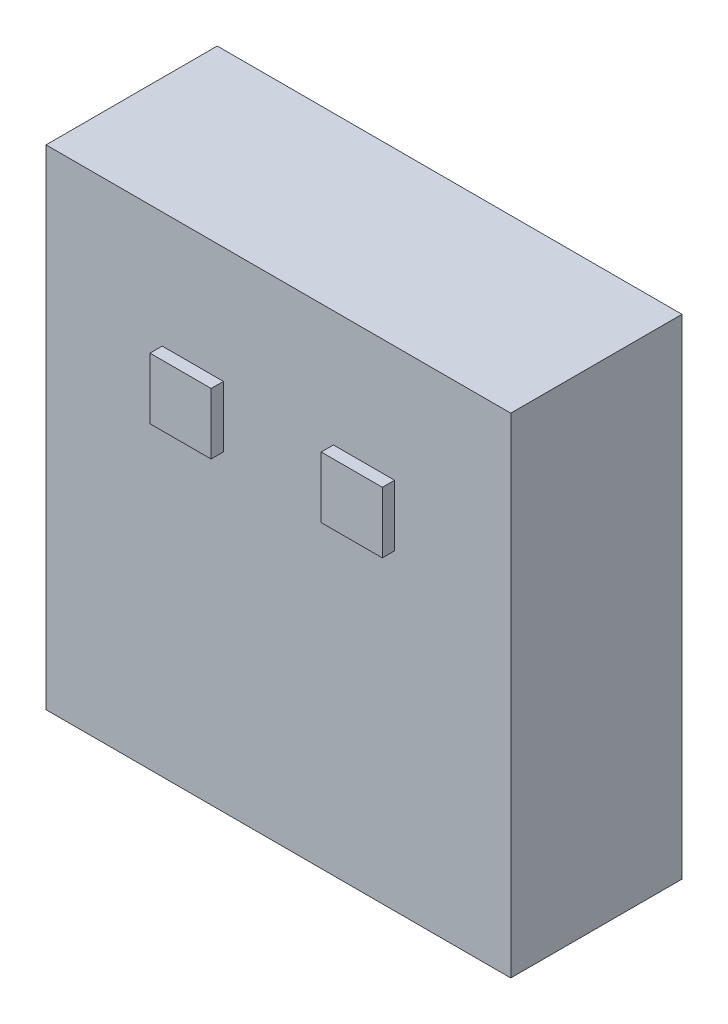
ISO-10303-21;
HEADER;
FILE_DESCRIPTION(('STEP AP214'),'2;1');
FILE_NAME('part.step','',(''),(''),'','','');
FILE_SCHEMA(('AUTOMOTIVE_DESIGN { 1 0 10303 214 1 1 1 1 }'));
ENDSEC;
DATA;
#1=APPLICATION_CONTEXT('core data for automotive mechanical design processes');
#2=APPLICATION_PROTOCOL_DEFINITION('international standard','automotive_design',2000,#1);
#3=PRODUCT_CONTEXT('',#1,'mechanical');
#4=PRODUCT('Part','Part','',(#3));
#5=PRODUCT_RELATED_PRODUCT_CATEGORY('part','',(#4));
#6=PRODUCT_DEFINITION_FORMATION('','',#4);
#7=PRODUCT_DEFINITION_CONTEXT('part definition',#1,'design');
#8=PRODUCT_DEFINITION('design','',#6,#7);
#9=PRODUCT_DEFINITION_SHAPE('','',#8);
#10=(LENGTH_UNIT() NAMED_UNIT(*) SI_UNIT(.MILLI.,.METRE.));
#11=(NAMED_UNIT(*) PLANE_ANGLE_UNIT() SI_UNIT($,.RADIAN.));
#12=(NAMED_UNIT(*) SI_UNIT($,.STERADIAN.) SOLID_ANGLE_UNIT());
#13=UNCERTAINTY_MEASURE_WITH_UNIT(LENGTH_MEASURE(1.E-05),#10,'distance_accuracy_value','');
#14=(GEOMETRIC_REPRESENTATION_CONTEXT(3) GLOBAL_UNCERTAINTY_ASSIGNED_CONTEXT((#13)) GLOBAL_UNIT_ASSIGNED_CONTEXT((#10,
#11,#12)) REPRESENTATION_CONTEXT('',''));
#15=CARTESIAN_POINT('',(0.,0.,0.));
#16=DIRECTION('',(0.,0.,1.));
#17=DIRECTION('',(1.,0.,0.));
#18=AXIS2_PLACEMENT_3D('',#15,#16,#17);
#19=CARTESIAN_POINT('',(0.,0.,14.));
#20=DIRECTION('',(0.,0.,-1.));
#21=DIRECTION('',(-1.,0.,0.));
#22=AXIS2_PLACEMENT_3D('',#19,#20,#21);
#23=PLANE('',#22);
#24=DIRECTION('',(0.,-1.,0.));
#25=VECTOR('',#24,1.);
#26=CARTESIAN_POINT('',(23.5,30.5,14.));
#27=LINE('',#26,#25);
#28=CARTESIAN_POINT('',(23.5,30.5,14.));
#29=VERTEX_POINT('',#28);
#30=CARTESIAN_POINT('',(23.5,25.5,14.));
#31=VERTEX_POINT('',#30);
#32=EDGE_CURVE('E181',#29,#31,#27,.T.);
#33=ORIENTED_EDGE('',*,*,#32,.F.);
#34=DIRECTION('',(-1.,0.,0.));
#35=VECTOR('',#34,1.);
#36=CARTESIAN_POINT('',(23.5,30.5,14.));
#37=LINE('',#36,#35);
#38=CARTESIAN_POINT('',(28.5,30.5,14.));
#39=VERTEX_POINT('',#38);
#40=EDGE_CURVE('E171',#39,#29,#37,.T.);
#41=ORIENTED_EDGE('',*,*,#40,.F.);
#42=DIRECTION('',(0.,1.,0.));
#43=VECTOR('',#42,1.);
#44=CARTESIAN_POINT('',(28.5,30.5,14.));
#45=LINE('',#44,#43);
#46=CARTESIAN_POINT('',(28.5,25.5,14.));
#47=VERTEX_POINT('',#46);
#48=EDGE_CURVE('E174',#47,#39,#45,.T.);
#49=ORIENTED_EDGE('',*,*,#48,.F.);
#50=DIRECTION('',(1.,0.,0.));
#51=VECTOR('',#50,1.);
#52=CARTESIAN_POINT('',(23.5,25.5,14.));
#53=LINE('',#52,#51);
#54=EDGE_CURVE('E178',#31,#47,#53,.T.);
#55=ORIENTED_EDGE('',*,*,#54,.F.);
#56=EDGE_LOOP('',(#33,#41,#49,#55));
#57=FACE_BOUND('',#56,.T.);
#58=DIRECTION('',(0.,-1.,0.));
#59=VECTOR('',#58,1.);
#60=CARTESIAN_POINT('',(0.,0.,14.));
#61=LINE('',#60,#59);
#62=CARTESIAN_POINT('',(0.,40.,14.));
#63=VERTEX_POINT('',#62);
#64=CARTESIAN_POINT('',(0.,0.,14.));
#65=VERTEX_POINT('',#64);
#66=EDGE_CURVE('E191',#63,#65,#61,.T.);
#67=ORIENTED_EDGE('',*,*,#66,.T.);
#68=DIRECTION('',(1.,0.,0.));
#69=VECTOR('',#68,1.);
#70=CARTESIAN_POINT('',(0.,0.,14.));
#71=LINE('',#70,#69);
#72=CARTESIAN_POINT('',(38.,0.,14.));
#73=VERTEX_POINT('',#72);
#74=EDGE_CURVE('E194',#65,#73,#71,.T.);
#75=ORIENTED_EDGE('',*,*,#74,.T.);
#76=DIRECTION('',(0.,1.,0.));
#77=VECTOR('',#76,1.);
#78=CARTESIAN_POINT('',(38.,0.,14.));
#79=LINE('',#78,#77);
#80=CARTESIAN_POINT('',(38.,40.,14.));
#81=VERTEX_POINT('',#80);
#82=EDGE_CURVE('E197',#73,#81,#79,.T.);
#83=ORIENTED_EDGE('',*,*,#82,.T.);
#84=DIRECTION('',(-1.,0.,0.));
#85=VECTOR('',#84,1.);
#86=CARTESIAN_POINT('',(0.,40.,14.));
#87=LINE('',#86,#85);
#88=EDGE_CURVE('E199',#81,#63,#87,.T.);
#89=ORIENTED_EDGE('',*,*,#88,.T.);
#90=EDGE_LOOP('',(#67,#75,#83,#89));
#91=FACE_BOUND('',#90,.T.);
#92=DIRECTION('',(-1.,0.,0.));
#93=VECTOR('',#92,1.);
#94=CARTESIAN_POINT('',(14.5,30.5,14.));
#95=LINE('',#94,#93);
#96=CARTESIAN_POINT('',(14.5,30.5,14.));
#97=VERTEX_POINT('',#96);
#98=CARTESIAN_POINT('',(9.5,30.5,14.));
#99=VERTEX_POINT('',#98);
#100=EDGE_CURVE('E148',#97,#99,#95,.T.);
#101=ORIENTED_EDGE('',*,*,#100,.F.);
#102=DIRECTION('',(0.,1.,0.));
#103=VECTOR('',#102,1.);
#104=CARTESIAN_POINT('',(14.5,30.5,14.));
#105=LINE('',#104,#103);
#106=CARTESIAN_POINT('',(14.5,25.5,14.));
#107=VERTEX_POINT('',#106);
#108=EDGE_CURVE('E145',#107,#97,#105,.T.);
#109=ORIENTED_EDGE('',*,*,#108,.F.);
#110=DIRECTION('',(1.,0.,0.));
#111=VECTOR('',#110,1.);
#112=CARTESIAN_POINT('',(14.5,25.5,14.));
#113=LINE('',#112,#111);
#114=CARTESIAN_POINT('',(9.5,25.5,14.));
#115=VERTEX_POINT('',#114);
#116=EDGE_CURVE('E59',#115,#107,#113,.T.);
#117=ORIENTED_EDGE('',*,*,#116,.F.);
#118=DIRECTION('',(0.,-1.,0.));
#119=VECTOR('',#118,1.);
#120=CARTESIAN_POINT('',(9.5,30.5,14.));
#121=LINE('',#120,#119);
#122=EDGE_CURVE('E54',#99,#115,#121,.T.);
#123=ORIENTED_EDGE('',*,*,#122,.F.);
#124=EDGE_LOOP('',(#101,#109,#117,#123));
#125=FACE_BOUND('',#124,.T.);
#126=ADVANCED_FACE('F39',(#57,#91,#125),#23,.F.);
#127=CARTESIAN_POINT('',(0.,0.,14.));
#128=DIRECTION('',(1.,0.,0.));
#129=DIRECTION('',(0.,0.,-1.));
#130=AXIS2_PLACEMENT_3D('',#127,#128,#129);
#131=PLANE('',#130);
#132=DIRECTION('',(0.,-1.,0.));
#133=VECTOR('',#132,1.);
#134=CARTESIAN_POINT('',(0.,0.,0.));
#135=LINE('',#134,#133);
#136=CARTESIAN_POINT('',(0.,40.,0.));
#137=VERTEX_POINT('',#136);
#138=CARTESIAN_POINT('',(0.,0.,0.));
#139=VERTEX_POINT('',#138);
#140=EDGE_CURVE('E149',#137,#139,#135,.T.);
#141=ORIENTED_EDGE('',*,*,#140,.T.);
#142=DIRECTION('',(0.,0.,-1.));
#143=VECTOR('',#142,1.);
#144=CARTESIAN_POINT('',(0.,0.,14.));
#145=LINE('',#144,#143);
#146=EDGE_CURVE('E11',#65,#139,#145,.T.);
#147=ORIENTED_EDGE('',*,*,#146,.F.);
#148=ORIENTED_EDGE('',*,*,#66,.F.);
#149=DIRECTION('',(0.,0.,-1.));
#150=VECTOR('',#149,1.);
#151=CARTESIAN_POINT('',(0.,40.,14.));
#152=LINE('',#151,#150);
#153=EDGE_CURVE('E200',#63,#137,#152,.T.);
#154=ORIENTED_EDGE('',*,*,#153,.T.);
#155=EDGE_LOOP('',(#141,#147,#148,#154));
#156=FACE_BOUND('',#155,.T.);
#157=ADVANCED_FACE('F41',(#156),#131,.F.);
#158=CARTESIAN_POINT('',(0.,0.,14.));
#159=DIRECTION('',(0.,1.,0.));
#160=DIRECTION('',(0.,0.,1.));
#161=AXIS2_PLACEMENT_3D('',#158,#159,#160);
#162=PLANE('',#161);
#163=DIRECTION('',(1.,0.,0.));
#164=VECTOR('',#163,1.);
#165=CARTESIAN_POINT('',(0.,0.,0.));
#166=LINE('',#165,#164);
#167=CARTESIAN_POINT('',(38.,0.,0.));
#168=VERTEX_POINT('',#167);
#169=EDGE_CURVE('E152',#139,#168,#166,.T.);
#170=ORIENTED_EDGE('',*,*,#169,.T.);
#171=DIRECTION('',(0.,0.,-1.));
#172=VECTOR('',#171,1.);
#173=CARTESIAN_POINT('',(38.,0.,14.));
#174=LINE('',#173,#172);
#175=EDGE_CURVE('E47',#73,#168,#174,.T.);
#176=ORIENTED_EDGE('',*,*,#175,.F.);
#177=ORIENTED_EDGE('',*,*,#74,.F.);
#178=ORIENTED_EDGE('',*,*,#146,.T.);
#179=EDGE_LOOP('',(#170,#176,#177,#178));
#180=FACE_BOUND('',#179,.T.);
#181=ADVANCED_FACE('F230',(#180),#162,.F.);
#182=CARTESIAN_POINT('',(38.,0.,14.));
#183=DIRECTION('',(-1.,0.,0.));
#184=DIRECTION('',(0.,0.,1.));
#185=AXIS2_PLACEMENT_3D('',#182,#183,#184);
#186=PLANE('',#185);
#187=DIRECTION('',(0.,1.,0.));
#188=VECTOR('',#187,1.);
#189=CARTESIAN_POINT('',(38.,0.,0.));
#190=LINE('',#189,#188);
#191=CARTESIAN_POINT('',(38.,40.,0.));
#192=VERTEX_POINT('',#191);
#193=EDGE_CURVE('E203',#168,#192,#190,.T.);
#194=ORIENTED_EDGE('',*,*,#193,.T.);
#195=DIRECTION('',(0.,0.,-1.));
#196=VECTOR('',#195,1.);
#197=CARTESIAN_POINT('',(38.,40.,14.));
#198=LINE('',#197,#196);
#199=EDGE_CURVE('E208',#81,#192,#198,.T.);
#200=ORIENTED_EDGE('',*,*,#199,.F.);
#201=ORIENTED_EDGE('',*,*,#82,.F.);
#202=ORIENTED_EDGE('',*,*,#175,.T.);
#203=EDGE_LOOP('',(#194,#200,#201,#202));
#204=FACE_BOUND('',#203,.T.);
#205=ADVANCED_FACE('F215',(#204),#186,.F.);
#206=CARTESIAN_POINT('',(0.,40.,14.));
#207=DIRECTION('',(0.,-1.,0.));
#208=DIRECTION('',(0.,0.,-1.));
#209=AXIS2_PLACEMENT_3D('',#206,#207,#208);
#210=PLANE('',#209);
#211=DIRECTION('',(-1.,0.,0.));
#212=VECTOR('',#211,1.);
#213=CARTESIAN_POINT('',(0.,40.,0.));
#214=LINE('',#213,#212);
#215=EDGE_CURVE('E195',#192,#137,#214,.T.);
#216=ORIENTED_EDGE('',*,*,#215,.T.);
#217=ORIENTED_EDGE('',*,*,#153,.F.);
#218=ORIENTED_EDGE('',*,*,#88,.F.);
#219=ORIENTED_EDGE('',*,*,#199,.T.);
#220=EDGE_LOOP('',(#216,#217,#218,#219));
#221=FACE_BOUND('',#220,.T.);
#222=ADVANCED_FACE('F224',(#221),#210,.F.);
#223=CARTESIAN_POINT('',(0.,0.,0.));
#224=DIRECTION('',(0.,0.,-1.));
#225=DIRECTION('',(-1.,0.,0.));
#226=AXIS2_PLACEMENT_3D('',#223,#224,#225);
#227=PLANE('',#226);
#228=ORIENTED_EDGE('',*,*,#140,.F.);
#229=ORIENTED_EDGE('',*,*,#215,.F.);
#230=ORIENTED_EDGE('',*,*,#193,.F.);
#231=ORIENTED_EDGE('',*,*,#169,.F.);
#232=EDGE_LOOP('',(#228,#229,#230,#231));
#233=FACE_BOUND('',#232,.T.);
#234=ADVANCED_FACE('F221',(#233),#227,.T.);
#235=CARTESIAN_POINT('',(23.5,30.5,15.));
#236=DIRECTION('',(1.,0.,0.));
#237=DIRECTION('',(0.,0.,-1.));
#238=AXIS2_PLACEMENT_3D('',#235,#236,#237);
#239=PLANE('',#238);
#240=ORIENTED_EDGE('',*,*,#32,.T.);
#241=DIRECTION('',(0.,0.,-1.));
#242=VECTOR('',#241,1.);
#243=CARTESIAN_POINT('',(23.5,25.5,15.));
#244=LINE('',#243,#242);
#245=CARTESIAN_POINT('',(23.5,25.5,15.));
#246=VERTEX_POINT('',#245);
#247=EDGE_CURVE('E158',#246,#31,#244,.T.);
#248=ORIENTED_EDGE('',*,*,#247,.F.);
#249=DIRECTION('',(0.,-1.,0.));
#250=VECTOR('',#249,1.);
#251=CARTESIAN_POINT('',(23.5,30.5,15.));
#252=LINE('',#251,#250);
#253=CARTESIAN_POINT('',(23.5,30.5,15.));
#254=VERTEX_POINT('',#253);
#255=EDGE_CURVE('E175',#254,#246,#252,.T.);
#256=ORIENTED_EDGE('',*,*,#255,.F.);
#257=DIRECTION('',(0.,0.,-1.));
#258=VECTOR('',#257,1.);
#259=CARTESIAN_POINT('',(23.5,30.5,15.));
#260=LINE('',#259,#258);
#261=EDGE_CURVE('E167',#254,#29,#260,.T.);
#262=ORIENTED_EDGE('',*,*,#261,.T.);
#263=EDGE_LOOP('',(#240,#248,#256,#262));
#264=FACE_BOUND('',#263,.T.);
#265=ADVANCED_FACE('F249',(#264),#239,.F.);
#266=CARTESIAN_POINT('',(23.5,25.5,15.));
#267=DIRECTION('',(0.,1.,0.));
#268=DIRECTION('',(-1.,0.,0.));
#269=AXIS2_PLACEMENT_3D('',#266,#267,#268);
#270=PLANE('',#269);
#271=ORIENTED_EDGE('',*,*,#54,.T.);
#272=DIRECTION('',(0.,0.,-1.));
#273=VECTOR('',#272,1.);
#274=CARTESIAN_POINT('',(28.5,25.5,15.));
#275=LINE('',#274,#273);
#276=CARTESIAN_POINT('',(28.5,25.5,15.));
#277=VERTEX_POINT('',#276);
#278=EDGE_CURVE('E161',#277,#47,#275,.T.);
#279=ORIENTED_EDGE('',*,*,#278,.F.);
#280=DIRECTION('',(1.,0.,0.));
#281=VECTOR('',#280,1.);
#282=CARTESIAN_POINT('',(23.5,25.5,15.));
#283=LINE('',#282,#281);
#284=EDGE_CURVE('E187',#246,#277,#283,.T.);
#285=ORIENTED_EDGE('',*,*,#284,.F.);
#286=ORIENTED_EDGE('',*,*,#247,.T.);
#287=EDGE_LOOP('',(#271,#279,#285,#286));
#288=FACE_BOUND('',#287,.T.);
#289=ADVANCED_FACE('F273',(#288),#270,.F.);
#290=CARTESIAN_POINT('',(28.5,30.5,15.));
#291=DIRECTION('',(-1.,0.,0.));
#292=DIRECTION('',(0.,-1.,0.));
#293=AXIS2_PLACEMENT_3D('',#290,#291,#292);
#294=PLANE('',#293);
#295=ORIENTED_EDGE('',*,*,#48,.T.);
#296=DIRECTION('',(0.,0.,-1.));
#297=VECTOR('',#296,1.);
#298=CARTESIAN_POINT('',(28.5,30.5,15.));
#299=LINE('',#298,#297);
#300=CARTESIAN_POINT('',(28.5,30.5,15.));
#301=VERTEX_POINT('',#300);
#302=EDGE_CURVE('E164',#301,#39,#299,.T.);
#303=ORIENTED_EDGE('',*,*,#302,.F.);
#304=DIRECTION('',(0.,1.,0.));
#305=VECTOR('',#304,1.);
#306=CARTESIAN_POINT('',(28.5,30.5,15.));
#307=LINE('',#306,#305);
#308=EDGE_CURVE('E185',#277,#301,#307,.T.);
#309=ORIENTED_EDGE('',*,*,#308,.F.);
#310=ORIENTED_EDGE('',*,*,#278,.T.);
#311=EDGE_LOOP('',(#295,#303,#309,#310));
#312=FACE_BOUND('',#311,.T.);
#313=ADVANCED_FACE('F283',(#312),#294,.F.);
#314=CARTESIAN_POINT('',(23.5,30.5,15.));
#315=DIRECTION('',(0.,-1.,0.));
#316=DIRECTION('',(0.,0.,-1.));
#317=AXIS2_PLACEMENT_3D('',#314,#315,#316);
#318=PLANE('',#317);
#319=ORIENTED_EDGE('',*,*,#40,.T.);
#320=ORIENTED_EDGE('',*,*,#261,.F.);
#321=DIRECTION('',(-1.,0.,0.));
#322=VECTOR('',#321,1.);
#323=CARTESIAN_POINT('',(23.5,30.5,15.));
#324=LINE('',#323,#322);
#325=EDGE_CURVE('E170',#301,#254,#324,.T.);
#326=ORIENTED_EDGE('',*,*,#325,.F.);
#327=ORIENTED_EDGE('',*,*,#302,.T.);
#328=EDGE_LOOP('',(#319,#320,#326,#327));
#329=FACE_BOUND('',#328,.T.);
#330=ADVANCED_FACE('F293',(#329),#318,.F.);
#331=CARTESIAN_POINT('',(0.,0.,15.));
#332=DIRECTION('',(0.,0.,1.));
#333=DIRECTION('',(1.,0.,0.));
#334=AXIS2_PLACEMENT_3D('',#331,#332,#333);
#335=PLANE('',#334);
#336=ORIENTED_EDGE('',*,*,#255,.T.);
#337=ORIENTED_EDGE('',*,*,#284,.T.);
#338=ORIENTED_EDGE('',*,*,#308,.T.);
#339=ORIENTED_EDGE('',*,*,#325,.T.);
#340=EDGE_LOOP('',(#336,#337,#338,#339));
#341=FACE_BOUND('',#340,.T.);
#342=ADVANCED_FACE('F246',(#341),#335,.T.);
#343=CARTESIAN_POINT('',(14.5,30.5,15.));
#344=DIRECTION('',(0.,-1.,0.));
#345=DIRECTION('',(0.,0.,-1.));
#346=AXIS2_PLACEMENT_3D('',#343,#344,#345);
#347=PLANE('',#346);
#348=ORIENTED_EDGE('',*,*,#100,.T.);
#349=DIRECTION('',(0.,0.,-1.));
#350=VECTOR('',#349,1.);
#351=CARTESIAN_POINT('',(9.5,30.5,15.));
#352=LINE('',#351,#350);
#353=CARTESIAN_POINT('',(9.5,30.5,15.));
#354=VERTEX_POINT('',#353);
#355=EDGE_CURVE('E129',#354,#99,#352,.T.);
#356=ORIENTED_EDGE('',*,*,#355,.F.);
#357=DIRECTION('',(-1.,0.,0.));
#358=VECTOR('',#357,1.);
#359=CARTESIAN_POINT('',(14.5,30.5,15.));
#360=LINE('',#359,#358);
#361=CARTESIAN_POINT('',(14.5,30.5,15.));
#362=VERTEX_POINT('',#361);
#363=EDGE_CURVE('E136',#362,#354,#360,.T.);
#364=ORIENTED_EDGE('',*,*,#363,.F.);
#365=DIRECTION('',(0.,0.,-1.));
#366=VECTOR('',#365,1.);
#367=CARTESIAN_POINT('',(14.5,30.5,15.));
#368=LINE('',#367,#366);
#369=EDGE_CURVE('E359',#362,#97,#368,.T.);
#370=ORIENTED_EDGE('',*,*,#369,.T.);
#371=EDGE_LOOP('',(#348,#356,#364,#370));
#372=FACE_BOUND('',#371,.T.);
#373=ADVANCED_FACE('F147',(#372),#347,.F.);
#374=CARTESIAN_POINT('',(9.5,30.5,15.));
#375=DIRECTION('',(1.,0.,0.));
#376=DIRECTION('',(0.,1.,0.));
#377=AXIS2_PLACEMENT_3D('',#374,#375,#376);
#378=PLANE('',#377);
#379=ORIENTED_EDGE('',*,*,#122,.T.);
#380=DIRECTION('',(0.,0.,-1.));
#381=VECTOR('',#380,1.);
#382=CARTESIAN_POINT('',(9.5,25.5,15.));
#383=LINE('',#382,#381);
#384=CARTESIAN_POINT('',(9.5,25.5,15.));
#385=VERTEX_POINT('',#384);
#386=EDGE_CURVE('E132',#385,#115,#383,.T.);
#387=ORIENTED_EDGE('',*,*,#386,.F.);
#388=DIRECTION('',(0.,-1.,0.));
#389=VECTOR('',#388,1.);
#390=CARTESIAN_POINT('',(9.5,30.5,15.));
#391=LINE('',#390,#389);
#392=EDGE_CURVE('E125',#354,#385,#391,.T.);
#393=ORIENTED_EDGE('',*,*,#392,.F.);
#394=ORIENTED_EDGE('',*,*,#355,.T.);
#395=EDGE_LOOP('',(#379,#387,#393,#394));
#396=FACE_BOUND('',#395,.T.);
#397=ADVANCED_FACE('F127',(#396),#378,.F.);
#398=CARTESIAN_POINT('',(14.5,25.5,15.));
#399=DIRECTION('',(0.,1.,0.));
#400=DIRECTION('',(-1.,0.,0.));
#401=AXIS2_PLACEMENT_3D('',#398,#399,#400);
#402=PLANE('',#401);
#403=ORIENTED_EDGE('',*,*,#116,.T.);
#404=DIRECTION('',(0.,0.,-1.));
#405=VECTOR('',#404,1.);
#406=CARTESIAN_POINT('',(14.5,25.5,15.));
#407=LINE('',#406,#405);
#408=CARTESIAN_POINT('',(14.5,25.5,15.));
#409=VERTEX_POINT('',#408);
#410=EDGE_CURVE('E154',#409,#107,#407,.T.);
#411=ORIENTED_EDGE('',*,*,#410,.F.);
#412=DIRECTION('',(1.,0.,0.));
#413=VECTOR('',#412,1.);
#414=CARTESIAN_POINT('',(14.5,25.5,15.));
#415=LINE('',#414,#413);
#416=EDGE_CURVE('E135',#385,#409,#415,.T.);
#417=ORIENTED_EDGE('',*,*,#416,.F.);
#418=ORIENTED_EDGE('',*,*,#386,.T.);
#419=EDGE_LOOP('',(#403,#411,#417,#418));
#420=FACE_BOUND('',#419,.T.);
#421=ADVANCED_FACE('F327',(#420),#402,.F.);
#422=CARTESIAN_POINT('',(14.5,30.5,15.));
#423=DIRECTION('',(-1.,0.,0.));
#424=DIRECTION('',(0.,0.,1.));
#425=AXIS2_PLACEMENT_3D('',#422,#423,#424);
#426=PLANE('',#425);
#427=ORIENTED_EDGE('',*,*,#108,.T.);
#428=ORIENTED_EDGE('',*,*,#369,.F.);
#429=DIRECTION('',(0.,1.,0.));
#430=VECTOR('',#429,1.);
#431=CARTESIAN_POINT('',(14.5,30.5,15.));
#432=LINE('',#431,#430);
#433=EDGE_CURVE('E141',#409,#362,#432,.T.);
#434=ORIENTED_EDGE('',*,*,#433,.F.);
#435=ORIENTED_EDGE('',*,*,#410,.T.);
#436=EDGE_LOOP('',(#427,#428,#434,#435));
#437=FACE_BOUND('',#436,.T.);
#438=ADVANCED_FACE('F336',(#437),#426,.F.);
#439=CARTESIAN_POINT('',(0.,0.,15.));
#440=DIRECTION('',(0.,0.,1.));
#441=DIRECTION('',(1.,0.,0.));
#442=AXIS2_PLACEMENT_3D('',#439,#440,#441);
#443=PLANE('',#442);
#444=ORIENTED_EDGE('',*,*,#363,.T.);
#445=ORIENTED_EDGE('',*,*,#392,.T.);
#446=ORIENTED_EDGE('',*,*,#416,.T.);
#447=ORIENTED_EDGE('',*,*,#433,.T.);
#448=EDGE_LOOP('',(#444,#445,#446,#447));
#449=FACE_BOUND('',#448,.T.);
#450=ADVANCED_FACE('F139',(#449),#443,.T.);
#451=CLOSED_SHELL('',(#126,#157,#181,#205,#222,#234,#265,#289,#313,#330,#342,#373,#397,#421,
#438,#450));
#452=MANIFOLD_SOLID_BREP('B2',#451);
#453=ADVANCED_BREP_SHAPE_REPRESENTATION('',(#18,#452),#14);
#454=SHAPE_DEFINITION_REPRESENTATION(#9,#453);
ENDSEC;
END-ISO-10303-21;
